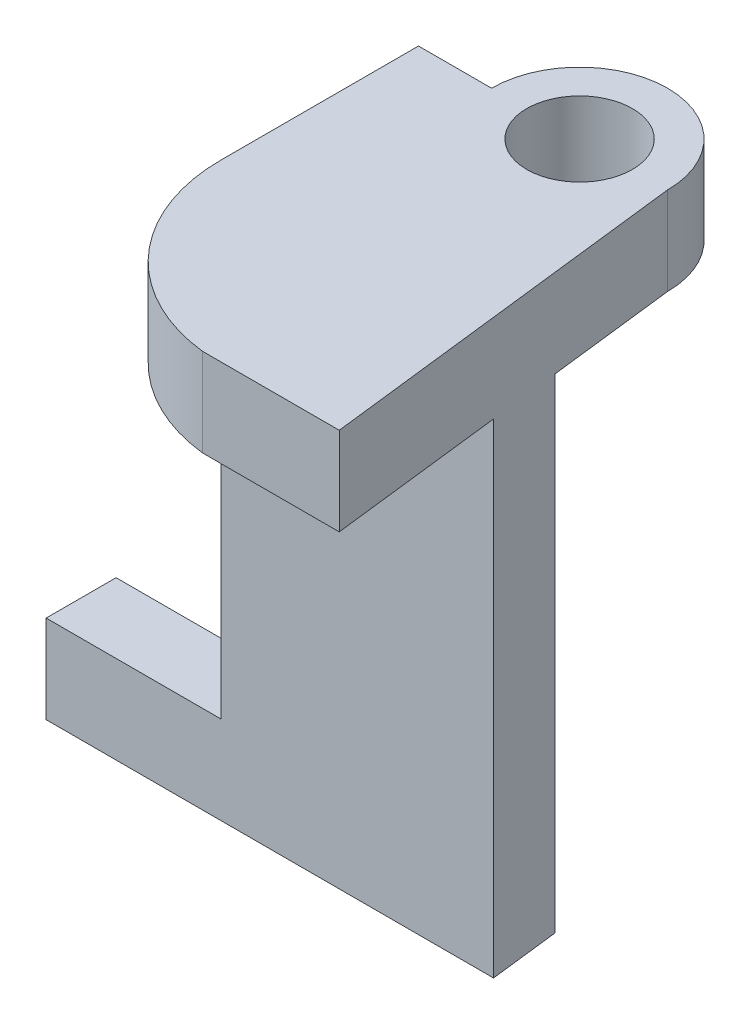
ISO-10303-21;
HEADER;
FILE_DESCRIPTION(('STEP AP214'),'2;1');
FILE_NAME('part.step','',(''),(''),'','','');
FILE_SCHEMA(('AUTOMOTIVE_DESIGN { 1 0 10303 214 1 1 1 1 }'));
ENDSEC;
DATA;
#1=APPLICATION_CONTEXT('core data for automotive mechanical design processes');
#2=APPLICATION_PROTOCOL_DEFINITION('international standard','automotive_design',2000,#1);
#3=PRODUCT_CONTEXT('',#1,'mechanical');
#4=PRODUCT('Part','Part','',(#3));
#5=PRODUCT_RELATED_PRODUCT_CATEGORY('part','',(#4));
#6=PRODUCT_DEFINITION_FORMATION('','',#4);
#7=PRODUCT_DEFINITION_CONTEXT('part definition',#1,'design');
#8=PRODUCT_DEFINITION('design','',#6,#7);
#9=PRODUCT_DEFINITION_SHAPE('','',#8);
#10=(LENGTH_UNIT() NAMED_UNIT(*) SI_UNIT(.MILLI.,.METRE.));
#11=(NAMED_UNIT(*) PLANE_ANGLE_UNIT() SI_UNIT($,.RADIAN.));
#12=(NAMED_UNIT(*) SI_UNIT($,.STERADIAN.) SOLID_ANGLE_UNIT());
#13=UNCERTAINTY_MEASURE_WITH_UNIT(LENGTH_MEASURE(1.E-05),#10,'distance_accuracy_value','');
#14=(GEOMETRIC_REPRESENTATION_CONTEXT(3) GLOBAL_UNCERTAINTY_ASSIGNED_CONTEXT((#13)) GLOBAL_UNIT_ASSIGNED_CONTEXT((#10,
#11,#12)) REPRESENTATION_CONTEXT('',''));
#15=CARTESIAN_POINT('',(0.,0.,0.));
#16=DIRECTION('',(0.,0.,1.));
#17=DIRECTION('',(1.,0.,0.));
#18=AXIS2_PLACEMENT_3D('',#15,#16,#17);
#19=CARTESIAN_POINT('',(0.85,0.,11.2123510145452));
#20=DIRECTION('',(0.,1.,0.));
#21=DIRECTION('',(0.,0.,1.));
#22=AXIS2_PLACEMENT_3D('',#19,#20,#21);
#23=PLANE('',#22);
#24=DIRECTION('',(-1.,0.,0.));
#25=VECTOR('',#24,1.);
#26=CARTESIAN_POINT('',(-9.15,0.,11.2123510145452));
#27=LINE('',#26,#25);
#28=CARTESIAN_POINT('',(6.32533699935523,0.,11.2123510145452));
#29=VERTEX_POINT('',#28);
#30=CARTESIAN_POINT('',(-9.15,0.,11.2123510145452));
#31=VERTEX_POINT('',#30);
#32=EDGE_CURVE('E53',#29,#31,#27,.T.);
#33=ORIENTED_EDGE('',*,*,#32,.F.);
#34=DIRECTION('',(-0.117386093763558,0.,-0.993086353239704));
#35=VECTOR('',#34,1.);
#36=CARTESIAN_POINT('',(7.5,0.,21.15));
#37=LINE('',#36,#35);
#38=CARTESIAN_POINT('',(7.5,0.,21.15));
#39=VERTEX_POINT('',#38);
#40=EDGE_CURVE('E200',#39,#29,#37,.T.);
#41=ORIENTED_EDGE('',*,*,#40,.F.);
#42=DIRECTION('',(1.,0.,0.));
#43=VECTOR('',#42,1.);
#44=CARTESIAN_POINT('',(7.5,0.,21.15));
#45=LINE('',#44,#43);
#46=CARTESIAN_POINT('',(-0.264958583038041,0.,21.15));
#47=VERTEX_POINT('',#46);
#48=EDGE_CURVE('E197',#47,#39,#45,.T.);
#49=ORIENTED_EDGE('',*,*,#48,.F.);
#50=CARTESIAN_POINT('',(0.85,0.,11.2123510145452));
#51=DIRECTION('',(0.,1.,0.));
#52=DIRECTION('',(0.,0.,1.));
#53=AXIS2_PLACEMENT_3D('',#50,#51,#52);
#54=CIRCLE('',#53,10.);
#55=EDGE_CURVE('E177',#31,#47,#54,.T.);
#56=ORIENTED_EDGE('',*,*,#55,.F.);
#57=EDGE_LOOP('',(#33,#41,#49,#56));
#58=FACE_BOUND('',#57,.T.);
#59=ADVANCED_FACE('F38',(#58),#23,.F.);
#60=CARTESIAN_POINT('',(0.,0.,0.));
#61=DIRECTION('',(0.,1.,0.));
#62=DIRECTION('',(0.,0.,1.));
#63=AXIS2_PLACEMENT_3D('',#60,#61,#62);
#64=CIRCLE('',#63,3.);
#65=CARTESIAN_POINT('',(0.,0.,3.));
#66=VERTEX_POINT('',#65);
#67=EDGE_CURVE('E173',#66,#66,#64,.T.);
#68=ORIENTED_EDGE('',*,*,#67,.T.);
#69=EDGE_LOOP('',(#68));
#70=FACE_BOUND('',#69,.T.);
#71=DIRECTION('',(1.,0.,0.));
#72=VECTOR('',#71,1.);
#73=CARTESIAN_POINT('',(-9.15,0.,7.24000560158644));
#74=LINE('',#73,#72);
#75=CARTESIAN_POINT('',(-9.15,0.,7.24000560158644));
#76=VERTEX_POINT('',#75);
#77=CARTESIAN_POINT('',(5.855792624301,0.,7.24000560158644));
#78=VERTEX_POINT('',#77);
#79=EDGE_CURVE('E61',#76,#78,#74,.T.);
#80=ORIENTED_EDGE('',*,*,#79,.F.);
#81=DIRECTION('',(0.,0.,1.));
#82=VECTOR('',#81,1.);
#83=CARTESIAN_POINT('',(-9.15,0.,0.));
#84=LINE('',#83,#82);
#85=CARTESIAN_POINT('',(-9.15,0.,0.));
#86=VERTEX_POINT('',#85);
#87=EDGE_CURVE('E184',#86,#76,#84,.T.);
#88=ORIENTED_EDGE('',*,*,#87,.F.);
#89=DIRECTION('',(-1.,0.,0.));
#90=VECTOR('',#89,1.);
#91=CARTESIAN_POINT('',(-5.,0.,0.));
#92=LINE('',#91,#90);
#93=CARTESIAN_POINT('',(-5.,0.,0.));
#94=VERTEX_POINT('',#93);
#95=EDGE_CURVE('E204',#94,#86,#92,.T.);
#96=ORIENTED_EDGE('',*,*,#95,.F.);
#97=CARTESIAN_POINT('',(0.,0.,0.));
#98=DIRECTION('',(0.,1.,0.));
#99=DIRECTION('',(0.,0.,1.));
#100=AXIS2_PLACEMENT_3D('',#97,#98,#99);
#101=CIRCLE('',#100,5.);
#102=CARTESIAN_POINT('',(5.,0.,0.));
#103=VERTEX_POINT('',#102);
#104=EDGE_CURVE('E202',#103,#94,#101,.T.);
#105=ORIENTED_EDGE('',*,*,#104,.F.);
#106=EDGE_CURVE('E199',#78,#103,#37,.T.);
#107=ORIENTED_EDGE('',*,*,#106,.F.);
#108=EDGE_LOOP('',(#80,#88,#96,#105,#107));
#109=FACE_BOUND('',#108,.T.);
#110=ADVANCED_FACE('F253',(#70,#109),#23,.F.);
#111=CARTESIAN_POINT('',(0.85,5.,11.2123510145452));
#112=DIRECTION('',(0.,1.,0.));
#113=DIRECTION('',(0.,0.,1.));
#114=AXIS2_PLACEMENT_3D('',#111,#112,#113);
#115=PLANE('',#114);
#116=CARTESIAN_POINT('',(0.85,5.,11.2123510145452));
#117=DIRECTION('',(0.,1.,0.));
#118=DIRECTION('',(0.,0.,1.));
#119=AXIS2_PLACEMENT_3D('',#116,#117,#118);
#120=CIRCLE('',#119,10.);
#121=CARTESIAN_POINT('',(-9.15,5.,11.2123510145452));
#122=VERTEX_POINT('',#121);
#123=CARTESIAN_POINT('',(-0.264958583038041,5.,21.15));
#124=VERTEX_POINT('',#123);
#125=EDGE_CURVE('E180',#122,#124,#120,.T.);
#126=ORIENTED_EDGE('',*,*,#125,.T.);
#127=DIRECTION('',(1.,0.,0.));
#128=VECTOR('',#127,1.);
#129=CARTESIAN_POINT('',(-0.127201333548002,5.,21.15));
#130=LINE('',#129,#128);
#131=CARTESIAN_POINT('',(7.5,5.,21.15));
#132=VERTEX_POINT('',#131);
#133=EDGE_CURVE('E183',#124,#132,#130,.T.);
#134=ORIENTED_EDGE('',*,*,#133,.T.);
#135=DIRECTION('',(-0.117386093763558,0.,-0.993086353239704));
#136=VECTOR('',#135,1.);
#137=CARTESIAN_POINT('',(7.5,5.,21.15));
#138=LINE('',#137,#136);
#139=CARTESIAN_POINT('',(5.,5.,0.));
#140=VERTEX_POINT('',#139);
#141=EDGE_CURVE('E186',#132,#140,#138,.T.);
#142=ORIENTED_EDGE('',*,*,#141,.T.);
#143=CARTESIAN_POINT('',(0.,5.,0.));
#144=DIRECTION('',(0.,1.,0.));
#145=DIRECTION('',(0.,0.,1.));
#146=AXIS2_PLACEMENT_3D('',#143,#144,#145);
#147=CIRCLE('',#146,5.);
#148=CARTESIAN_POINT('',(-5.,5.,0.));
#149=VERTEX_POINT('',#148);
#150=EDGE_CURVE('E188',#140,#149,#147,.T.);
#151=ORIENTED_EDGE('',*,*,#150,.T.);
#152=DIRECTION('',(-1.,0.,0.));
#153=VECTOR('',#152,1.);
#154=CARTESIAN_POINT('',(-5.,5.,0.));
#155=LINE('',#154,#153);
#156=CARTESIAN_POINT('',(-9.15,5.,0.));
#157=VERTEX_POINT('',#156);
#158=EDGE_CURVE('E190',#149,#157,#155,.T.);
#159=ORIENTED_EDGE('',*,*,#158,.T.);
#160=DIRECTION('',(0.,0.,1.));
#161=VECTOR('',#160,1.);
#162=CARTESIAN_POINT('',(-9.15,5.,0.));
#163=LINE('',#162,#161);
#164=EDGE_CURVE('E192',#157,#122,#163,.T.);
#165=ORIENTED_EDGE('',*,*,#164,.T.);
#166=EDGE_LOOP('',(#126,#134,#142,#151,#159,#165));
#167=FACE_BOUND('',#166,.T.);
#168=CARTESIAN_POINT('',(0.,5.,0.));
#169=DIRECTION('',(0.,1.,0.));
#170=DIRECTION('',(0.,0.,1.));
#171=AXIS2_PLACEMENT_3D('',#168,#169,#170);
#172=CIRCLE('',#171,3.);
#173=CARTESIAN_POINT('',(0.,5.,3.));
#174=VERTEX_POINT('',#173);
#175=EDGE_CURVE('E174',#174,#174,#172,.T.);
#176=ORIENTED_EDGE('',*,*,#175,.F.);
#177=EDGE_LOOP('',(#176));
#178=FACE_BOUND('',#177,.T.);
#179=ADVANCED_FACE('F258',(#167,#178),#115,.T.);
#180=CARTESIAN_POINT('',(0.85,5.,11.2123510145452));
#181=DIRECTION('',(0.,-1.,0.));
#182=DIRECTION('',(0.,0.,-1.));
#183=AXIS2_PLACEMENT_3D('',#180,#181,#182);
#184=CYLINDRICAL_SURFACE('',#183,10.);
#185=ORIENTED_EDGE('',*,*,#55,.T.);
#186=DIRECTION('',(0.,-1.,0.));
#187=VECTOR('',#186,1.);
#188=CARTESIAN_POINT('',(-0.264958583038041,5.,21.15));
#189=LINE('',#188,#187);
#190=EDGE_CURVE('E11',#124,#47,#189,.T.);
#191=ORIENTED_EDGE('',*,*,#190,.F.);
#192=ORIENTED_EDGE('',*,*,#125,.F.);
#193=DIRECTION('',(0.,-1.,0.));
#194=VECTOR('',#193,1.);
#195=CARTESIAN_POINT('',(-9.15,5.,11.2123510145452));
#196=LINE('',#195,#194);
#197=EDGE_CURVE('E194',#122,#31,#196,.T.);
#198=ORIENTED_EDGE('',*,*,#197,.T.);
#199=EDGE_LOOP('',(#185,#191,#192,#198));
#200=FACE_BOUND('',#199,.T.);
#201=ADVANCED_FACE('F40',(#200),#184,.T.);
#202=CARTESIAN_POINT('',(7.5,5.,21.15));
#203=DIRECTION('',(0.,0.,-1.));
#204=DIRECTION('',(-1.,0.,0.));
#205=AXIS2_PLACEMENT_3D('',#202,#203,#204);
#206=PLANE('',#205);
#207=ORIENTED_EDGE('',*,*,#48,.T.);
#208=DIRECTION('',(0.,-1.,0.));
#209=VECTOR('',#208,1.);
#210=CARTESIAN_POINT('',(7.5,5.,21.15));
#211=LINE('',#210,#209);
#212=EDGE_CURVE('E46',#132,#39,#211,.T.);
#213=ORIENTED_EDGE('',*,*,#212,.F.);
#214=ORIENTED_EDGE('',*,*,#133,.F.);
#215=ORIENTED_EDGE('',*,*,#190,.T.);
#216=EDGE_LOOP('',(#207,#213,#214,#215));
#217=FACE_BOUND('',#216,.T.);
#218=ADVANCED_FACE('F224',(#217),#206,.F.);
#219=CARTESIAN_POINT('',(7.5,5.,21.15));
#220=DIRECTION('',(-0.993086353239704,0.,0.117386093763558));
#221=DIRECTION('',(0.117386093763558,0.,0.993086353239704));
#222=AXIS2_PLACEMENT_3D('',#219,#220,#221);
#223=PLANE('',#222);
#224=ORIENTED_EDGE('',*,*,#40,.T.);
#225=DIRECTION('',(0.,1.,0.));
#226=VECTOR('',#225,1.);
#227=CARTESIAN_POINT('',(6.32533699935523,-22.5,11.2123510145452));
#228=LINE('',#227,#226);
#229=CARTESIAN_POINT('',(6.32533699935523,-27.5,11.2123510145452));
#230=VERTEX_POINT('',#229);
#231=EDGE_CURVE('E165',#230,#29,#228,.T.);
#232=ORIENTED_EDGE('',*,*,#231,.F.);
#233=DIRECTION('',(0.117386093763559,0.,0.993086353239704));
#234=VECTOR('',#233,1.);
#235=CARTESIAN_POINT('',(5.855792624301,-27.5,7.24000560158644));
#236=LINE('',#235,#234);
#237=CARTESIAN_POINT('',(5.855792624301,-27.5,7.24000560158644));
#238=VERTEX_POINT('',#237);
#239=EDGE_CURVE('E144',#238,#230,#236,.T.);
#240=ORIENTED_EDGE('',*,*,#239,.F.);
#241=DIRECTION('',(0.,1.,0.));
#242=VECTOR('',#241,1.);
#243=CARTESIAN_POINT('',(5.855792624301,-22.5,7.24000560158644));
#244=LINE('',#243,#242);
#245=EDGE_CURVE('E167',#238,#78,#244,.T.);
#246=ORIENTED_EDGE('',*,*,#245,.T.);
#247=ORIENTED_EDGE('',*,*,#106,.T.);
#248=DIRECTION('',(0.,-1.,0.));
#249=VECTOR('',#248,1.);
#250=CARTESIAN_POINT('',(5.,5.,0.));
#251=LINE('',#250,#249);
#252=EDGE_CURVE('E214',#140,#103,#251,.T.);
#253=ORIENTED_EDGE('',*,*,#252,.F.);
#254=ORIENTED_EDGE('',*,*,#141,.F.);
#255=ORIENTED_EDGE('',*,*,#212,.T.);
#256=EDGE_LOOP('',(#224,#232,#240,#246,#247,#253,#254,#255));
#257=FACE_BOUND('',#256,.T.);
#258=ADVANCED_FACE('F220',(#257),#223,.F.);
#259=CARTESIAN_POINT('',(0.,5.,0.));
#260=DIRECTION('',(0.,-1.,0.));
#261=DIRECTION('',(0.,0.,-1.));
#262=AXIS2_PLACEMENT_3D('',#259,#260,#261);
#263=CYLINDRICAL_SURFACE('',#262,5.);
#264=ORIENTED_EDGE('',*,*,#104,.T.);
#265=DIRECTION('',(0.,-1.,0.));
#266=VECTOR('',#265,1.);
#267=CARTESIAN_POINT('',(-5.,5.,0.));
#268=LINE('',#267,#266);
#269=EDGE_CURVE('E211',#149,#94,#268,.T.);
#270=ORIENTED_EDGE('',*,*,#269,.F.);
#271=ORIENTED_EDGE('',*,*,#150,.F.);
#272=ORIENTED_EDGE('',*,*,#252,.T.);
#273=EDGE_LOOP('',(#264,#270,#271,#272));
#274=FACE_BOUND('',#273,.T.);
#275=ADVANCED_FACE('F269',(#274),#263,.T.);
#276=CARTESIAN_POINT('',(-5.,5.,0.));
#277=DIRECTION('',(0.,0.,1.));
#278=DIRECTION('',(1.,0.,0.));
#279=AXIS2_PLACEMENT_3D('',#276,#277,#278);
#280=PLANE('',#279);
#281=ORIENTED_EDGE('',*,*,#95,.T.);
#282=DIRECTION('',(0.,-1.,0.));
#283=VECTOR('',#282,1.);
#284=CARTESIAN_POINT('',(-9.15,5.,0.));
#285=LINE('',#284,#283);
#286=EDGE_CURVE('E208',#157,#86,#285,.T.);
#287=ORIENTED_EDGE('',*,*,#286,.F.);
#288=ORIENTED_EDGE('',*,*,#158,.F.);
#289=ORIENTED_EDGE('',*,*,#269,.T.);
#290=EDGE_LOOP('',(#281,#287,#288,#289));
#291=FACE_BOUND('',#290,.T.);
#292=ADVANCED_FACE('F266',(#291),#280,.F.);
#293=CARTESIAN_POINT('',(-9.15,5.,0.));
#294=DIRECTION('',(1.,0.,0.));
#295=DIRECTION('',(0.,0.,-1.));
#296=AXIS2_PLACEMENT_3D('',#293,#294,#295);
#297=PLANE('',#296);
#298=ORIENTED_EDGE('',*,*,#87,.T.);
#299=DIRECTION('',(0.,1.,0.));
#300=VECTOR('',#299,1.);
#301=CARTESIAN_POINT('',(-9.15,-22.5,7.24000560158644));
#302=LINE('',#301,#300);
#303=CARTESIAN_POINT('',(-9.15,-22.5,7.24000560158643));
#304=VERTEX_POINT('',#303);
#305=EDGE_CURVE('E170',#304,#76,#302,.T.);
#306=ORIENTED_EDGE('',*,*,#305,.F.);
#307=DIRECTION('',(0.,0.,-1.));
#308=VECTOR('',#307,1.);
#309=CARTESIAN_POINT('',(-9.15,-22.5,11.2123510145452));
#310=LINE('',#309,#308);
#311=CARTESIAN_POINT('',(-9.15,-22.5,11.2123510145452));
#312=VERTEX_POINT('',#311);
#313=EDGE_CURVE('E158',#312,#304,#310,.T.);
#314=ORIENTED_EDGE('',*,*,#313,.F.);
#315=DIRECTION('',(0.,1.,0.));
#316=VECTOR('',#315,1.);
#317=CARTESIAN_POINT('',(-9.15,-22.5,11.2123510145452));
#318=LINE('',#317,#316);
#319=EDGE_CURVE('E160',#312,#31,#318,.T.);
#320=ORIENTED_EDGE('',*,*,#319,.T.);
#321=ORIENTED_EDGE('',*,*,#197,.F.);
#322=ORIENTED_EDGE('',*,*,#164,.F.);
#323=ORIENTED_EDGE('',*,*,#286,.T.);
#324=EDGE_LOOP('',(#298,#306,#314,#320,#321,#322,#323));
#325=FACE_BOUND('',#324,.T.);
#326=ADVANCED_FACE('F230',(#325),#297,.F.);
#327=CARTESIAN_POINT('',(0.,5.,0.));
#328=DIRECTION('',(0.,-1.,0.));
#329=DIRECTION('',(0.,0.,-1.));
#330=AXIS2_PLACEMENT_3D('',#327,#328,#329);
#331=CYLINDRICAL_SURFACE('',#330,3.);
#332=ORIENTED_EDGE('',*,*,#175,.T.);
#333=EDGE_LOOP('',(#332));
#334=FACE_BOUND('',#333,.T.);
#335=ORIENTED_EDGE('',*,*,#67,.F.);
#336=EDGE_LOOP('',(#335));
#337=FACE_BOUND('',#336,.T.);
#338=ADVANCED_FACE('F265',(#334,#337),#331,.F.);
#339=CARTESIAN_POINT('',(-9.15,-22.5,7.24000560158644));
#340=DIRECTION('',(0.,0.,1.));
#341=DIRECTION('',(1.,0.,0.));
#342=AXIS2_PLACEMENT_3D('',#339,#340,#341);
#343=PLANE('',#342);
#344=ORIENTED_EDGE('',*,*,#79,.T.);
#345=ORIENTED_EDGE('',*,*,#245,.F.);
#346=DIRECTION('',(1.,0.,0.));
#347=VECTOR('',#346,1.);
#348=CARTESIAN_POINT('',(5.855792624301,-27.5,7.24000560158644));
#349=LINE('',#348,#347);
#350=CARTESIAN_POINT('',(-19.0851751515225,-27.5,7.24000560158643));
#351=VERTEX_POINT('',#350);
#352=EDGE_CURVE('E137',#351,#238,#349,.T.);
#353=ORIENTED_EDGE('',*,*,#352,.F.);
#354=DIRECTION('',(0.,1.,0.));
#355=VECTOR('',#354,1.);
#356=CARTESIAN_POINT('',(-19.0851751515225,-27.5,7.24000560158643));
#357=LINE('',#356,#355);
#358=CARTESIAN_POINT('',(-19.0851751515225,-22.5,7.24000560158643));
#359=VERTEX_POINT('',#358);
#360=EDGE_CURVE('E133',#351,#359,#357,.T.);
#361=ORIENTED_EDGE('',*,*,#360,.T.);
#362=DIRECTION('',(1.,0.,0.));
#363=VECTOR('',#362,1.);
#364=CARTESIAN_POINT('',(5.855792624301,-22.5,7.24000560158644));
#365=LINE('',#364,#363);
#366=EDGE_CURVE('E147',#359,#304,#365,.T.);
#367=ORIENTED_EDGE('',*,*,#366,.T.);
#368=ORIENTED_EDGE('',*,*,#305,.T.);
#369=EDGE_LOOP('',(#344,#345,#353,#361,#367,#368));
#370=FACE_BOUND('',#369,.T.);
#371=ADVANCED_FACE('F240',(#370),#343,.F.);
#372=CARTESIAN_POINT('',(-9.15,-22.5,11.2123510145452));
#373=DIRECTION('',(0.,0.,-1.));
#374=DIRECTION('',(-1.,0.,0.));
#375=AXIS2_PLACEMENT_3D('',#372,#373,#374);
#376=PLANE('',#375);
#377=ORIENTED_EDGE('',*,*,#32,.T.);
#378=ORIENTED_EDGE('',*,*,#319,.F.);
#379=DIRECTION('',(-1.,0.,0.));
#380=VECTOR('',#379,1.);
#381=CARTESIAN_POINT('',(6.32533699935523,-22.5,11.2123510145452));
#382=LINE('',#381,#380);
#383=CARTESIAN_POINT('',(-19.0851751515225,-22.5,11.2123510145452));
#384=VERTEX_POINT('',#383);
#385=EDGE_CURVE('E151',#312,#384,#382,.T.);
#386=ORIENTED_EDGE('',*,*,#385,.T.);
#387=DIRECTION('',(0.,1.,0.));
#388=VECTOR('',#387,1.);
#389=CARTESIAN_POINT('',(-19.0851751515225,-27.5,11.2123510145452));
#390=LINE('',#389,#388);
#391=CARTESIAN_POINT('',(-19.0851751515225,-27.5,11.2123510145452));
#392=VERTEX_POINT('',#391);
#393=EDGE_CURVE('E131',#392,#384,#390,.T.);
#394=ORIENTED_EDGE('',*,*,#393,.F.);
#395=DIRECTION('',(-1.,0.,0.));
#396=VECTOR('',#395,1.);
#397=CARTESIAN_POINT('',(6.32533699935523,-27.5,11.2123510145452));
#398=LINE('',#397,#396);
#399=EDGE_CURVE('E138',#230,#392,#398,.T.);
#400=ORIENTED_EDGE('',*,*,#399,.F.);
#401=ORIENTED_EDGE('',*,*,#231,.T.);
#402=EDGE_LOOP('',(#377,#378,#386,#394,#400,#401));
#403=FACE_BOUND('',#402,.T.);
#404=ADVANCED_FACE('F149',(#403),#376,.F.);
#405=CARTESIAN_POINT('',(0.,-22.5,0.));
#406=DIRECTION('',(0.,-1.,0.));
#407=DIRECTION('',(0.,0.,-1.));
#408=AXIS2_PLACEMENT_3D('',#405,#406,#407);
#409=PLANE('',#408);
#410=ORIENTED_EDGE('',*,*,#385,.F.);
#411=ORIENTED_EDGE('',*,*,#313,.T.);
#412=ORIENTED_EDGE('',*,*,#366,.F.);
#413=DIRECTION('',(0.,0.,-1.));
#414=VECTOR('',#413,1.);
#415=CARTESIAN_POINT('',(-19.0851751515225,-22.5,11.2123510145452));
#416=LINE('',#415,#414);
#417=EDGE_CURVE('E236',#384,#359,#416,.T.);
#418=ORIENTED_EDGE('',*,*,#417,.F.);
#419=EDGE_LOOP('',(#410,#411,#412,#418));
#420=FACE_BOUND('',#419,.T.);
#421=ADVANCED_FACE('F242',(#420),#409,.F.);
#422=CARTESIAN_POINT('',(-19.0851751515225,-27.5,11.2123510145452));
#423=DIRECTION('',(1.,0.,0.));
#424=DIRECTION('',(0.,0.,-1.));
#425=AXIS2_PLACEMENT_3D('',#422,#423,#424);
#426=PLANE('',#425);
#427=ORIENTED_EDGE('',*,*,#417,.T.);
#428=ORIENTED_EDGE('',*,*,#360,.F.);
#429=DIRECTION('',(0.,0.,-1.));
#430=VECTOR('',#429,1.);
#431=CARTESIAN_POINT('',(-19.0851751515225,-27.5,11.2123510145452));
#432=LINE('',#431,#430);
#433=EDGE_CURVE('E127',#392,#351,#432,.T.);
#434=ORIENTED_EDGE('',*,*,#433,.F.);
#435=ORIENTED_EDGE('',*,*,#393,.T.);
#436=EDGE_LOOP('',(#427,#428,#434,#435));
#437=FACE_BOUND('',#436,.T.);
#438=ADVANCED_FACE('F129',(#437),#426,.F.);
#439=CARTESIAN_POINT('',(0.,-27.5,0.));
#440=DIRECTION('',(0.,-1.,0.));
#441=DIRECTION('',(0.,0.,-1.));
#442=AXIS2_PLACEMENT_3D('',#439,#440,#441);
#443=PLANE('',#442);
#444=ORIENTED_EDGE('',*,*,#399,.T.);
#445=ORIENTED_EDGE('',*,*,#433,.T.);
#446=ORIENTED_EDGE('',*,*,#352,.T.);
#447=ORIENTED_EDGE('',*,*,#239,.T.);
#448=EDGE_LOOP('',(#444,#445,#446,#447));
#449=FACE_BOUND('',#448,.T.);
#450=ADVANCED_FACE('F142',(#449),#443,.T.);
#451=CLOSED_SHELL('',(#59,#110,#179,#201,#218,#258,#275,#292,#326,#338,#371,#404,#421,#438,#450));
#452=MANIFOLD_SOLID_BREP('B2',#451);
#453=ADVANCED_BREP_SHAPE_REPRESENTATION('',(#18,#452),#14);
#454=SHAPE_DEFINITION_REPRESENTATION(#9,#453);
ENDSEC;
END-ISO-10303-21;
